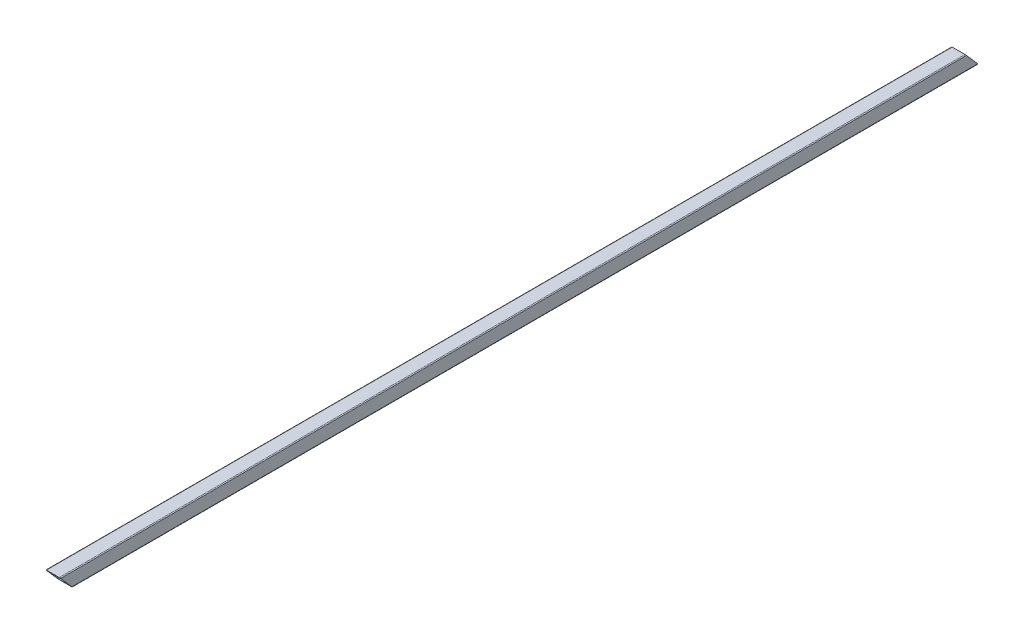
ISO-10303-21;
HEADER;
FILE_DESCRIPTION(('STEP AP214'),'2;1');
FILE_NAME('part.step','',(''),(''),'','','');
FILE_SCHEMA(('AUTOMOTIVE_DESIGN { 1 0 10303 214 1 1 1 1 }'));
ENDSEC;
DATA;
#1=APPLICATION_CONTEXT('core data for automotive mechanical design processes');
#2=APPLICATION_PROTOCOL_DEFINITION('international standard','automotive_design',2000,#1);
#3=PRODUCT_CONTEXT('',#1,'mechanical');
#4=PRODUCT('Part','Part','',(#3));
#5=PRODUCT_RELATED_PRODUCT_CATEGORY('part','',(#4));
#6=PRODUCT_DEFINITION_FORMATION('','',#4);
#7=PRODUCT_DEFINITION_CONTEXT('part definition',#1,'design');
#8=PRODUCT_DEFINITION('design','',#6,#7);
#9=PRODUCT_DEFINITION_SHAPE('','',#8);
#10=(LENGTH_UNIT() NAMED_UNIT(*) SI_UNIT(.MILLI.,.METRE.));
#11=(NAMED_UNIT(*) PLANE_ANGLE_UNIT() SI_UNIT($,.RADIAN.));
#12=(NAMED_UNIT(*) SI_UNIT($,.STERADIAN.) SOLID_ANGLE_UNIT());
#13=UNCERTAINTY_MEASURE_WITH_UNIT(LENGTH_MEASURE(1.E-05),#10,'distance_accuracy_value','');
#14=(GEOMETRIC_REPRESENTATION_CONTEXT(3) GLOBAL_UNCERTAINTY_ASSIGNED_CONTEXT((#13)) GLOBAL_UNIT_ASSIGNED_CONTEXT((#10,
#11,#12)) REPRESENTATION_CONTEXT('',''));
#15=CARTESIAN_POINT('',(0.,0.,0.));
#16=DIRECTION('',(0.,0.,1.));
#17=DIRECTION('',(1.,0.,0.));
#18=AXIS2_PLACEMENT_3D('',#15,#16,#17);
#19=CARTESIAN_POINT('',(-50.,22.,1648.34951321524));
#20=DIRECTION('',(1.,0.,0.));
#21=DIRECTION('',(0.,0.,-1.));
#22=AXIS2_PLACEMENT_3D('',#19,#20,#21);
#23=PLANE('',#22);
#24=DIRECTION('',(0.,-0.753477823126875,-0.657473322695291));
#25=VECTOR('',#24,1.);
#26=CARTESIAN_POINT('',(-50.,53.2499633570719,1612.53641852334));
#27=LINE('',#26,#25);
#28=CARTESIAN_POINT('',(-50.,22.,1585.26817437355));
#29=VERTEX_POINT('',#28);
#30=CARTESIAN_POINT('',(-50.,-22.,1546.87444159115));
#31=VERTEX_POINT('',#30);
#32=EDGE_CURVE('E232',#29,#31,#27,.T.);
#33=ORIENTED_EDGE('',*,*,#32,.F.);
#34=DIRECTION('',(0.,0.,-1.));
#35=VECTOR('',#34,1.);
#36=CARTESIAN_POINT('',(-50.,22.,1648.34951321524));
#37=LINE('',#36,#35);
#38=CARTESIAN_POINT('',(-50.,22.,-1546.87444159116));
#39=VERTEX_POINT('',#38);
#40=EDGE_CURVE('E49',#29,#39,#37,.T.);
#41=ORIENTED_EDGE('',*,*,#40,.T.);
#42=DIRECTION('',(0.,-0.753477823126875,-0.657473322695291));
#43=VECTOR('',#42,1.);
#44=CARTESIAN_POINT('',(-50.,-28.2698948395353,-1590.73918953361));
#45=LINE('',#44,#43);
#46=CARTESIAN_POINT('',(-50.,-22.,-1585.26817437355));
#47=VERTEX_POINT('',#46);
#48=EDGE_CURVE('E200',#39,#47,#45,.T.);
#49=ORIENTED_EDGE('',*,*,#48,.T.);
#50=DIRECTION('',(0.,0.,-1.));
#51=VECTOR('',#50,1.);
#52=CARTESIAN_POINT('',(-50.,-22.,1648.34951321524));
#53=LINE('',#52,#51);
#54=EDGE_CURVE('E269',#31,#47,#53,.T.);
#55=ORIENTED_EDGE('',*,*,#54,.F.);
#56=EDGE_LOOP('',(#33,#41,#49,#55));
#57=FACE_BOUND('',#56,.T.);
#58=ADVANCED_FACE('F34',(#57),#23,.F.);
#59=CARTESIAN_POINT('',(-47.,22.,1648.34951321524));
#60=DIRECTION('',(0.,0.,-1.));
#61=DIRECTION('',(-1.,0.,0.));
#62=AXIS2_PLACEMENT_3D('',#59,#60,#61);
#63=CYLINDRICAL_SURFACE('',#62,3.00000000000001);
#64=CARTESIAN_POINT('',(-47.,22.,1585.26817437355));
#65=DIRECTION('',(0.,-0.657473322695291,0.753477823126875));
#66=DIRECTION('',(0.,-0.753477823126875,-0.657473322695291));
#67=AXIS2_PLACEMENT_3D('',#64,#65,#66);
#68=ELLIPSE('',#67,3.98153722368396,3.00000000000001);
#69=CARTESIAN_POINT('',(-47.,25.,1587.88592888144));
#70=VERTEX_POINT('',#69);
#71=EDGE_CURVE('E235',#70,#29,#68,.T.);
#72=ORIENTED_EDGE('',*,*,#71,.F.);
#73=DIRECTION('',(0.,0.,-1.));
#74=VECTOR('',#73,1.);
#75=CARTESIAN_POINT('',(-47.,25.,1648.34951321524));
#76=LINE('',#75,#74);
#77=CARTESIAN_POINT('',(-47.,25.,-1544.25668708327));
#78=VERTEX_POINT('',#77);
#79=EDGE_CURVE('E272',#70,#78,#76,.T.);
#80=ORIENTED_EDGE('',*,*,#79,.T.);
#81=CARTESIAN_POINT('',(-47.,22.,-1546.87444159116));
#82=DIRECTION('',(0.,0.657473322695291,-0.753477823126875));
#83=DIRECTION('',(0.,0.753477823126875,0.657473322695291));
#84=AXIS2_PLACEMENT_3D('',#81,#82,#83);
#85=ELLIPSE('',#84,3.98153722368395,3.00000000000001);
#86=EDGE_CURVE('E203',#78,#39,#85,.F.);
#87=ORIENTED_EDGE('',*,*,#86,.T.);
#88=ORIENTED_EDGE('',*,*,#40,.F.);
#89=EDGE_LOOP('',(#72,#80,#87,#88));
#90=FACE_BOUND('',#89,.T.);
#91=ADVANCED_FACE('F289',(#90),#63,.T.);
#92=CARTESIAN_POINT('',(-47.,25.,1648.34951321524));
#93=DIRECTION('',(0.,-1.,0.));
#94=DIRECTION('',(1.,0.,0.));
#95=AXIS2_PLACEMENT_3D('',#92,#93,#94);
#96=PLANE('',#95);
#97=DIRECTION('',(-1.,0.,0.));
#98=VECTOR('',#97,1.);
#99=CARTESIAN_POINT('',(-47.,25.,1587.88592888144));
#100=LINE('',#99,#98);
#101=CARTESIAN_POINT('',(-3.00000000000001,25.,1587.88592888144));
#102=VERTEX_POINT('',#101);
#103=EDGE_CURVE('E238',#102,#70,#100,.T.);
#104=ORIENTED_EDGE('',*,*,#103,.F.);
#105=DIRECTION('',(0.,0.,-1.));
#106=VECTOR('',#105,1.);
#107=CARTESIAN_POINT('',(-3.00000000000001,25.,1648.34951321524));
#108=LINE('',#107,#106);
#109=CARTESIAN_POINT('',(-3.00000000000001,25.,-1544.25668708327));
#110=VERTEX_POINT('',#109);
#111=EDGE_CURVE('E274',#102,#110,#108,.T.);
#112=ORIENTED_EDGE('',*,*,#111,.T.);
#113=DIRECTION('',(-1.,0.,0.));
#114=VECTOR('',#113,1.);
#115=CARTESIAN_POINT('',(-47.,25.,-1544.25668708327));
#116=LINE('',#115,#114);
#117=EDGE_CURVE('E205',#110,#78,#116,.T.);
#118=ORIENTED_EDGE('',*,*,#117,.T.);
#119=ORIENTED_EDGE('',*,*,#79,.F.);
#120=EDGE_LOOP('',(#104,#112,#118,#119));
#121=FACE_BOUND('',#120,.T.);
#122=ADVANCED_FACE('F291',(#121),#96,.F.);
#123=CARTESIAN_POINT('',(-3.00000000000001,22.,1648.34951321524));
#124=DIRECTION('',(0.,0.,-1.));
#125=DIRECTION('',(-1.,0.,0.));
#126=AXIS2_PLACEMENT_3D('',#123,#124,#125);
#127=CYLINDRICAL_SURFACE('',#126,3.00000000000001);
#128=CARTESIAN_POINT('',(-3.00000000000001,22.,1585.26817437355));
#129=DIRECTION('',(0.,-0.657473322695291,0.753477823126875));
#130=DIRECTION('',(0.,-0.753477823126875,-0.657473322695291));
#131=AXIS2_PLACEMENT_3D('',#128,#129,#130);
#132=ELLIPSE('',#131,3.98153722368396,3.00000000000001);
#133=CARTESIAN_POINT('',(0.,22.,1585.26817437355));
#134=VERTEX_POINT('',#133);
#135=EDGE_CURVE('E241',#134,#102,#132,.T.);
#136=ORIENTED_EDGE('',*,*,#135,.F.);
#137=DIRECTION('',(0.,0.,-1.));
#138=VECTOR('',#137,1.);
#139=CARTESIAN_POINT('',(0.,22.,1648.34951321524));
#140=LINE('',#139,#138);
#141=CARTESIAN_POINT('',(0.,22.,-1546.87444159116));
#142=VERTEX_POINT('',#141);
#143=EDGE_CURVE('E276',#134,#142,#140,.T.);
#144=ORIENTED_EDGE('',*,*,#143,.T.);
#145=CARTESIAN_POINT('',(-3.00000000000001,22.,-1546.87444159116));
#146=DIRECTION('',(0.,0.657473322695291,-0.753477823126875));
#147=DIRECTION('',(0.,0.753477823126875,0.657473322695291));
#148=AXIS2_PLACEMENT_3D('',#145,#146,#147);
#149=ELLIPSE('',#148,3.98153722368396,3.00000000000001);
#150=EDGE_CURVE('E208',#142,#110,#149,.F.);
#151=ORIENTED_EDGE('',*,*,#150,.T.);
#152=ORIENTED_EDGE('',*,*,#111,.F.);
#153=EDGE_LOOP('',(#136,#144,#151,#152));
#154=FACE_BOUND('',#153,.T.);
#155=ADVANCED_FACE('F295',(#154),#127,.T.);
#156=CARTESIAN_POINT('',(0.,22.,1648.34951321524));
#157=DIRECTION('',(-1.,0.,0.));
#158=DIRECTION('',(0.,0.,1.));
#159=AXIS2_PLACEMENT_3D('',#156,#157,#158);
#160=PLANE('',#159);
#161=DIRECTION('',(0.,0.753477823126875,0.657473322695291));
#162=VECTOR('',#161,1.);
#163=CARTESIAN_POINT('',(0.,53.2499633570719,1612.53641852334));
#164=LINE('',#163,#162);
#165=CARTESIAN_POINT('',(0.,-22.,1546.87444159115));
#166=VERTEX_POINT('',#165);
#167=EDGE_CURVE('E244',#166,#134,#164,.T.);
#168=ORIENTED_EDGE('',*,*,#167,.F.);
#169=DIRECTION('',(0.,0.,-1.));
#170=VECTOR('',#169,1.);
#171=CARTESIAN_POINT('',(0.,-22.,1648.34951321524));
#172=LINE('',#171,#170);
#173=CARTESIAN_POINT('',(0.,-22.,-1585.26817437355));
#174=VERTEX_POINT('',#173);
#175=EDGE_CURVE('E157',#166,#174,#172,.T.);
#176=ORIENTED_EDGE('',*,*,#175,.T.);
#177=DIRECTION('',(0.,0.753477823126875,0.657473322695291));
#178=VECTOR('',#177,1.);
#179=CARTESIAN_POINT('',(0.,-28.2698948395353,-1590.73918953361));
#180=LINE('',#179,#178);
#181=EDGE_CURVE('E169',#174,#142,#180,.T.);
#182=ORIENTED_EDGE('',*,*,#181,.T.);
#183=ORIENTED_EDGE('',*,*,#143,.F.);
#184=EDGE_LOOP('',(#168,#176,#182,#183));
#185=FACE_BOUND('',#184,.T.);
#186=ADVANCED_FACE('F279',(#185),#160,.F.);
#187=CARTESIAN_POINT('',(-3.00000000000001,-22.,1648.34951321524));
#188=DIRECTION('',(0.,0.,-1.));
#189=DIRECTION('',(-1.,0.,0.));
#190=AXIS2_PLACEMENT_3D('',#187,#188,#189);
#191=CYLINDRICAL_SURFACE('',#190,3.);
#192=CARTESIAN_POINT('',(-3.00000000000001,-22.,1546.87444159115));
#193=DIRECTION('',(0.,-0.657473322695291,0.753477823126875));
#194=DIRECTION('',(0.,-0.753477823126875,-0.657473322695291));
#195=AXIS2_PLACEMENT_3D('',#192,#193,#194);
#196=ELLIPSE('',#195,3.98153722368395,3.);
#197=CARTESIAN_POINT('',(-3.,-25.,1544.25668708326));
#198=VERTEX_POINT('',#197);
#199=EDGE_CURVE('E153',#198,#166,#196,.T.);
#200=ORIENTED_EDGE('',*,*,#199,.F.);
#201=DIRECTION('',(0.,0.,-1.));
#202=VECTOR('',#201,1.);
#203=CARTESIAN_POINT('',(-3.,-25.,1648.34951321524));
#204=LINE('',#203,#202);
#205=CARTESIAN_POINT('',(-3.,-25.,-1587.88592888144));
#206=VERTEX_POINT('',#205);
#207=EDGE_CURVE('E147',#198,#206,#204,.T.);
#208=ORIENTED_EDGE('',*,*,#207,.T.);
#209=CARTESIAN_POINT('',(-3.00000000000001,-22.,-1585.26817437355));
#210=DIRECTION('',(0.,0.657473322695291,-0.753477823126875));
#211=DIRECTION('',(0.,0.753477823126875,0.657473322695291));
#212=AXIS2_PLACEMENT_3D('',#209,#210,#211);
#213=ELLIPSE('',#212,3.98153722368395,3.);
#214=EDGE_CURVE('E151',#206,#174,#213,.F.);
#215=ORIENTED_EDGE('',*,*,#214,.T.);
#216=ORIENTED_EDGE('',*,*,#175,.F.);
#217=EDGE_LOOP('',(#200,#208,#215,#216));
#218=FACE_BOUND('',#217,.T.);
#219=ADVANCED_FACE('F149',(#218),#191,.T.);
#220=CARTESIAN_POINT('',(-47.,-25.,1648.34951321524));
#221=DIRECTION('',(0.,1.,0.));
#222=DIRECTION('',(0.,0.,1.));
#223=AXIS2_PLACEMENT_3D('',#220,#221,#222);
#224=PLANE('',#223);
#225=DIRECTION('',(1.,0.,0.));
#226=VECTOR('',#225,1.);
#227=CARTESIAN_POINT('',(-47.,-25.,1544.25668708326));
#228=LINE('',#227,#226);
#229=CARTESIAN_POINT('',(-47.,-25.,1544.25668708326));
#230=VERTEX_POINT('',#229);
#231=EDGE_CURVE('E248',#230,#198,#228,.T.);
#232=ORIENTED_EDGE('',*,*,#231,.F.);
#233=DIRECTION('',(0.,0.,-1.));
#234=VECTOR('',#233,1.);
#235=CARTESIAN_POINT('',(-47.,-25.,1648.34951321524));
#236=LINE('',#235,#234);
#237=CARTESIAN_POINT('',(-47.,-25.,-1587.88592888144));
#238=VERTEX_POINT('',#237);
#239=EDGE_CURVE('E42',#230,#238,#236,.T.);
#240=ORIENTED_EDGE('',*,*,#239,.T.);
#241=DIRECTION('',(1.,0.,0.));
#242=VECTOR('',#241,1.);
#243=CARTESIAN_POINT('',(-47.,-25.,-1587.88592888144));
#244=LINE('',#243,#242);
#245=EDGE_CURVE('E165',#238,#206,#244,.T.);
#246=ORIENTED_EDGE('',*,*,#245,.T.);
#247=ORIENTED_EDGE('',*,*,#207,.F.);
#248=EDGE_LOOP('',(#232,#240,#246,#247));
#249=FACE_BOUND('',#248,.T.);
#250=ADVANCED_FACE('F171',(#249),#224,.F.);
#251=CARTESIAN_POINT('',(-47.,-22.,1648.34951321524));
#252=DIRECTION('',(0.,0.,-1.));
#253=DIRECTION('',(-1.,0.,0.));
#254=AXIS2_PLACEMENT_3D('',#251,#252,#253);
#255=CYLINDRICAL_SURFACE('',#254,3.);
#256=CARTESIAN_POINT('',(-47.,-22.,1546.87444159115));
#257=DIRECTION('',(0.,-0.657473322695291,0.753477823126875));
#258=DIRECTION('',(0.,-0.753477823126875,-0.657473322695291));
#259=AXIS2_PLACEMENT_3D('',#256,#257,#258);
#260=ELLIPSE('',#259,3.98153722368395,3.);
#261=EDGE_CURVE('E250',#31,#230,#260,.T.);
#262=ORIENTED_EDGE('',*,*,#261,.F.);
#263=ORIENTED_EDGE('',*,*,#54,.T.);
#264=CARTESIAN_POINT('',(-47.,-22.,-1585.26817437355));
#265=DIRECTION('',(0.,0.657473322695291,-0.753477823126875));
#266=DIRECTION('',(0.,0.753477823126875,0.657473322695291));
#267=AXIS2_PLACEMENT_3D('',#264,#265,#266);
#268=ELLIPSE('',#267,3.98153722368395,3.);
#269=EDGE_CURVE('E198',#47,#238,#268,.F.);
#270=ORIENTED_EDGE('',*,*,#269,.T.);
#271=ORIENTED_EDGE('',*,*,#239,.F.);
#272=EDGE_LOOP('',(#262,#263,#270,#271));
#273=FACE_BOUND('',#272,.T.);
#274=ADVANCED_FACE('F36',(#273),#255,.T.);
#275=CARTESIAN_POINT('',(-47.,20.,1648.34951321524));
#276=DIRECTION('',(1.,0.,0.));
#277=DIRECTION('',(0.,0.,-1.));
#278=AXIS2_PLACEMENT_3D('',#275,#276,#277);
#279=PLANE('',#278);
#280=DIRECTION('',(0.,0.,-1.));
#281=VECTOR('',#280,1.);
#282=CARTESIAN_POINT('',(-47.,20.,1648.34951321524));
#283=LINE('',#282,#281);
#284=CARTESIAN_POINT('',(-47.,20.,1583.52300470162));
#285=VERTEX_POINT('',#284);
#286=CARTESIAN_POINT('',(-47.,20.,-1548.61961126308));
#287=VERTEX_POINT('',#286);
#288=EDGE_CURVE('E255',#285,#287,#283,.T.);
#289=ORIENTED_EDGE('',*,*,#288,.F.);
#290=DIRECTION('',(0.,-0.753477823126875,-0.657473322695291));
#291=VECTOR('',#290,1.);
#292=CARTESIAN_POINT('',(-47.,52.1145056971838,1611.54563538745));
#293=LINE('',#292,#291);
#294=CARTESIAN_POINT('',(-47.,-20.,1548.61961126308));
#295=VERTEX_POINT('',#294);
#296=EDGE_CURVE('E11',#285,#295,#293,.T.);
#297=ORIENTED_EDGE('',*,*,#296,.T.);
#298=DIRECTION('',(0.,0.,-1.));
#299=VECTOR('',#298,1.);
#300=CARTESIAN_POINT('',(-47.,-20.,1648.34951321524));
#301=LINE('',#300,#299);
#302=CARTESIAN_POINT('',(-47.,-20.,-1583.52300470162));
#303=VERTEX_POINT('',#302);
#304=EDGE_CURVE('E253',#295,#303,#301,.T.);
#305=ORIENTED_EDGE('',*,*,#304,.T.);
#306=DIRECTION('',(0.,-0.753477823126875,-0.657473322695291));
#307=VECTOR('',#306,1.);
#308=CARTESIAN_POINT('',(-47.,-29.4053524994233,-1591.72997266951));
#309=LINE('',#308,#307);
#310=EDGE_CURVE('E173',#287,#303,#309,.T.);
#311=ORIENTED_EDGE('',*,*,#310,.F.);
#312=EDGE_LOOP('',(#289,#297,#305,#311));
#313=FACE_BOUND('',#312,.T.);
#314=ADVANCED_FACE('F338',(#313),#279,.T.);
#315=CARTESIAN_POINT('',(-45.,20.,1648.34951321524));
#316=DIRECTION('',(0.,0.,-1.));
#317=DIRECTION('',(-1.,0.,0.));
#318=AXIS2_PLACEMENT_3D('',#315,#316,#317);
#319=CYLINDRICAL_SURFACE('',#318,2.);
#320=DIRECTION('',(0.,0.,-1.));
#321=VECTOR('',#320,1.);
#322=CARTESIAN_POINT('',(-45.,22.,1648.34951321524));
#323=LINE('',#322,#321);
#324=CARTESIAN_POINT('',(-45.,22.,1585.26817437355));
#325=VERTEX_POINT('',#324);
#326=CARTESIAN_POINT('',(-45.,22.,-1546.87444159116));
#327=VERTEX_POINT('',#326);
#328=EDGE_CURVE('E257',#325,#327,#323,.T.);
#329=ORIENTED_EDGE('',*,*,#328,.F.);
#330=CARTESIAN_POINT('',(-45.,20.,1583.52300470162));
#331=DIRECTION('',(0.,-0.657473322695291,0.753477823126875));
#332=DIRECTION('',(0.,-0.753477823126875,-0.657473322695291));
#333=AXIS2_PLACEMENT_3D('',#330,#331,#332);
#334=ELLIPSE('',#333,2.65435814912263,2.);
#335=EDGE_CURVE('E185',#325,#285,#334,.T.);
#336=ORIENTED_EDGE('',*,*,#335,.T.);
#337=ORIENTED_EDGE('',*,*,#288,.T.);
#338=CARTESIAN_POINT('',(-45.,20.,-1548.61961126308));
#339=DIRECTION('',(0.,0.657473322695291,-0.753477823126875));
#340=DIRECTION('',(0.,0.753477823126875,0.657473322695291));
#341=AXIS2_PLACEMENT_3D('',#338,#339,#340);
#342=ELLIPSE('',#341,2.65435814912263,2.);
#343=EDGE_CURVE('E182',#327,#287,#342,.F.);
#344=ORIENTED_EDGE('',*,*,#343,.F.);
#345=EDGE_LOOP('',(#329,#336,#337,#344));
#346=FACE_BOUND('',#345,.T.);
#347=ADVANCED_FACE('F334',(#346),#319,.F.);
#348=CARTESIAN_POINT('',(-45.,22.,1648.34951321524));
#349=DIRECTION('',(0.,-1.,0.));
#350=DIRECTION('',(0.,0.,-1.));
#351=AXIS2_PLACEMENT_3D('',#348,#349,#350);
#352=PLANE('',#351);
#353=DIRECTION('',(0.,0.,-1.));
#354=VECTOR('',#353,1.);
#355=CARTESIAN_POINT('',(-5.00000000000001,22.,1648.34951321524));
#356=LINE('',#355,#354);
#357=CARTESIAN_POINT('',(-5.00000000000001,22.,1585.26817437355));
#358=VERTEX_POINT('',#357);
#359=CARTESIAN_POINT('',(-5.00000000000001,22.,-1546.87444159116));
#360=VERTEX_POINT('',#359);
#361=EDGE_CURVE('E259',#358,#360,#356,.T.);
#362=ORIENTED_EDGE('',*,*,#361,.F.);
#363=DIRECTION('',(-1.,0.,0.));
#364=VECTOR('',#363,1.);
#365=CARTESIAN_POINT('',(-45.,22.,1585.26817437355));
#366=LINE('',#365,#364);
#367=EDGE_CURVE('E216',#358,#325,#366,.T.);
#368=ORIENTED_EDGE('',*,*,#367,.T.);
#369=ORIENTED_EDGE('',*,*,#328,.T.);
#370=DIRECTION('',(-1.,0.,0.));
#371=VECTOR('',#370,1.);
#372=CARTESIAN_POINT('',(-45.,22.,-1546.87444159116));
#373=LINE('',#372,#371);
#374=EDGE_CURVE('E186',#360,#327,#373,.T.);
#375=ORIENTED_EDGE('',*,*,#374,.F.);
#376=EDGE_LOOP('',(#362,#368,#369,#375));
#377=FACE_BOUND('',#376,.T.);
#378=ADVANCED_FACE('F330',(#377),#352,.T.);
#379=CARTESIAN_POINT('',(-5.00000000000001,20.,1648.34951321524));
#380=DIRECTION('',(0.,0.,-1.));
#381=DIRECTION('',(-1.,0.,0.));
#382=AXIS2_PLACEMENT_3D('',#379,#380,#381);
#383=CYLINDRICAL_SURFACE('',#382,2.);
#384=DIRECTION('',(0.,0.,-1.));
#385=VECTOR('',#384,1.);
#386=CARTESIAN_POINT('',(-3.00000000000001,20.,1648.34951321524));
#387=LINE('',#386,#385);
#388=CARTESIAN_POINT('',(-3.00000000000001,20.,1583.52300470162));
#389=VERTEX_POINT('',#388);
#390=CARTESIAN_POINT('',(-3.00000000000001,20.,-1548.61961126308));
#391=VERTEX_POINT('',#390);
#392=EDGE_CURVE('E261',#389,#391,#387,.T.);
#393=ORIENTED_EDGE('',*,*,#392,.F.);
#394=CARTESIAN_POINT('',(-5.00000000000001,20.,1583.52300470162));
#395=DIRECTION('',(0.,-0.657473322695291,0.753477823126875));
#396=DIRECTION('',(0.,-0.753477823126875,-0.657473322695291));
#397=AXIS2_PLACEMENT_3D('',#394,#395,#396);
#398=ELLIPSE('',#397,2.65435814912263,2.);
#399=EDGE_CURVE('E219',#389,#358,#398,.T.);
#400=ORIENTED_EDGE('',*,*,#399,.T.);
#401=ORIENTED_EDGE('',*,*,#361,.T.);
#402=CARTESIAN_POINT('',(-5.00000000000001,20.,-1548.61961126308));
#403=DIRECTION('',(0.,0.657473322695291,-0.753477823126875));
#404=DIRECTION('',(0.,0.753477823126875,0.657473322695291));
#405=AXIS2_PLACEMENT_3D('',#402,#403,#404);
#406=ELLIPSE('',#405,2.65435814912263,2.);
#407=EDGE_CURVE('E189',#391,#360,#406,.F.);
#408=ORIENTED_EDGE('',*,*,#407,.F.);
#409=EDGE_LOOP('',(#393,#400,#401,#408));
#410=FACE_BOUND('',#409,.T.);
#411=ADVANCED_FACE('F326',(#410),#383,.F.);
#412=CARTESIAN_POINT('',(-3.00000000000001,20.,1648.34951321524));
#413=DIRECTION('',(-1.,0.,0.));
#414=DIRECTION('',(0.,0.,1.));
#415=AXIS2_PLACEMENT_3D('',#412,#413,#414);
#416=PLANE('',#415);
#417=DIRECTION('',(0.,0.,-1.));
#418=VECTOR('',#417,1.);
#419=CARTESIAN_POINT('',(-3.00000000000001,-20.,1648.34951321524));
#420=LINE('',#419,#418);
#421=CARTESIAN_POINT('',(-3.00000000000001,-20.,1548.61961126308));
#422=VERTEX_POINT('',#421);
#423=CARTESIAN_POINT('',(-3.00000000000001,-20.,-1583.52300470162));
#424=VERTEX_POINT('',#423);
#425=EDGE_CURVE('E263',#422,#424,#420,.T.);
#426=ORIENTED_EDGE('',*,*,#425,.F.);
#427=DIRECTION('',(0.,0.753477823126875,0.657473322695291));
#428=VECTOR('',#427,1.);
#429=CARTESIAN_POINT('',(-3.00000000000001,52.1145056971838,1611.54563538745));
#430=LINE('',#429,#428);
#431=EDGE_CURVE('E222',#422,#389,#430,.T.);
#432=ORIENTED_EDGE('',*,*,#431,.T.);
#433=ORIENTED_EDGE('',*,*,#392,.T.);
#434=DIRECTION('',(0.,0.753477823126875,0.657473322695291));
#435=VECTOR('',#434,1.);
#436=CARTESIAN_POINT('',(-3.00000000000001,-29.4053524994233,-1591.72997266951));
#437=LINE('',#436,#435);
#438=EDGE_CURVE('E192',#424,#391,#437,.T.);
#439=ORIENTED_EDGE('',*,*,#438,.F.);
#440=EDGE_LOOP('',(#426,#432,#433,#439));
#441=FACE_BOUND('',#440,.T.);
#442=ADVANCED_FACE('F322',(#441),#416,.T.);
#443=CARTESIAN_POINT('',(-5.00000000000001,-20.,1648.34951321524));
#444=DIRECTION('',(0.,0.,-1.));
#445=DIRECTION('',(-1.,0.,0.));
#446=AXIS2_PLACEMENT_3D('',#443,#444,#445);
#447=CYLINDRICAL_SURFACE('',#446,2.);
#448=DIRECTION('',(0.,0.,-1.));
#449=VECTOR('',#448,1.);
#450=CARTESIAN_POINT('',(-5.00000000000001,-22.,1648.34951321524));
#451=LINE('',#450,#449);
#452=CARTESIAN_POINT('',(-5.00000000000001,-22.,1546.87444159115));
#453=VERTEX_POINT('',#452);
#454=CARTESIAN_POINT('',(-5.00000000000001,-22.,-1585.26817437355));
#455=VERTEX_POINT('',#454);
#456=EDGE_CURVE('E265',#453,#455,#451,.T.);
#457=ORIENTED_EDGE('',*,*,#456,.F.);
#458=CARTESIAN_POINT('',(-5.00000000000001,-20.,1548.61961126308));
#459=DIRECTION('',(0.,-0.657473322695291,0.753477823126875));
#460=DIRECTION('',(0.,-0.753477823126875,-0.657473322695291));
#461=AXIS2_PLACEMENT_3D('',#458,#459,#460);
#462=ELLIPSE('',#461,2.65435814912263,2.);
#463=EDGE_CURVE('E225',#453,#422,#462,.T.);
#464=ORIENTED_EDGE('',*,*,#463,.T.);
#465=ORIENTED_EDGE('',*,*,#425,.T.);
#466=CARTESIAN_POINT('',(-5.00000000000001,-20.,-1583.52300470162));
#467=DIRECTION('',(0.,0.657473322695291,-0.753477823126875));
#468=DIRECTION('',(0.,0.753477823126875,0.657473322695291));
#469=AXIS2_PLACEMENT_3D('',#466,#467,#468);
#470=ELLIPSE('',#469,2.65435814912263,2.);
#471=EDGE_CURVE('E195',#455,#424,#470,.F.);
#472=ORIENTED_EDGE('',*,*,#471,.F.);
#473=EDGE_LOOP('',(#457,#464,#465,#472));
#474=FACE_BOUND('',#473,.T.);
#475=ADVANCED_FACE('F318',(#474),#447,.F.);
#476=CARTESIAN_POINT('',(-45.,-22.,1648.34951321524));
#477=DIRECTION('',(0.,1.,0.));
#478=DIRECTION('',(0.,0.,1.));
#479=AXIS2_PLACEMENT_3D('',#476,#477,#478);
#480=PLANE('',#479);
#481=DIRECTION('',(0.,0.,-1.));
#482=VECTOR('',#481,1.);
#483=CARTESIAN_POINT('',(-45.,-22.,1648.34951321524));
#484=LINE('',#483,#482);
#485=CARTESIAN_POINT('',(-45.,-22.,1546.87444159115));
#486=VERTEX_POINT('',#485);
#487=CARTESIAN_POINT('',(-45.,-22.,-1585.26817437355));
#488=VERTEX_POINT('',#487);
#489=EDGE_CURVE('E267',#486,#488,#484,.T.);
#490=ORIENTED_EDGE('',*,*,#489,.F.);
#491=DIRECTION('',(1.,0.,0.));
#492=VECTOR('',#491,1.);
#493=CARTESIAN_POINT('',(-45.,-22.,1546.87444159115));
#494=LINE('',#493,#492);
#495=EDGE_CURVE('E228',#486,#453,#494,.T.);
#496=ORIENTED_EDGE('',*,*,#495,.T.);
#497=ORIENTED_EDGE('',*,*,#456,.T.);
#498=DIRECTION('',(1.,0.,0.));
#499=VECTOR('',#498,1.);
#500=CARTESIAN_POINT('',(-45.,-22.,-1585.26817437355));
#501=LINE('',#500,#499);
#502=EDGE_CURVE('E180',#488,#455,#501,.T.);
#503=ORIENTED_EDGE('',*,*,#502,.F.);
#504=EDGE_LOOP('',(#490,#496,#497,#503));
#505=FACE_BOUND('',#504,.T.);
#506=ADVANCED_FACE('F314',(#505),#480,.T.);
#507=CARTESIAN_POINT('',(-45.,-20.,1648.34951321524));
#508=DIRECTION('',(0.,0.,-1.));
#509=DIRECTION('',(-1.,0.,0.));
#510=AXIS2_PLACEMENT_3D('',#507,#508,#509);
#511=CYLINDRICAL_SURFACE('',#510,2.);
#512=ORIENTED_EDGE('',*,*,#304,.F.);
#513=CARTESIAN_POINT('',(-45.,-20.,1548.61961126308));
#514=DIRECTION('',(0.,-0.657473322695291,0.753477823126875));
#515=DIRECTION('',(0.,-0.753477823126875,-0.657473322695291));
#516=AXIS2_PLACEMENT_3D('',#513,#514,#515);
#517=ELLIPSE('',#516,2.65435814912263,2.);
#518=EDGE_CURVE('E57',#295,#486,#517,.T.);
#519=ORIENTED_EDGE('',*,*,#518,.T.);
#520=ORIENTED_EDGE('',*,*,#489,.T.);
#521=CARTESIAN_POINT('',(-45.,-20.,-1583.52300470162));
#522=DIRECTION('',(0.,0.657473322695291,-0.753477823126875));
#523=DIRECTION('',(0.,0.753477823126875,0.657473322695291));
#524=AXIS2_PLACEMENT_3D('',#521,#522,#523);
#525=ELLIPSE('',#524,2.65435814912263,2.);
#526=EDGE_CURVE('E176',#303,#488,#525,.F.);
#527=ORIENTED_EDGE('',*,*,#526,.F.);
#528=EDGE_LOOP('',(#512,#519,#520,#527));
#529=FACE_BOUND('',#528,.T.);
#530=ADVANCED_FACE('F311',(#529),#511,.F.);
#531=CARTESIAN_POINT('',(-93.9999999999994,162.743492870142,1708.07881201257));
#532=DIRECTION('',(0.,-0.657473322695291,0.753477823126875));
#533=DIRECTION('',(0.,-0.753477823126875,-0.657473322695291));
#534=AXIS2_PLACEMENT_3D('',#531,#532,#533);
#535=PLANE('',#534);
#536=ORIENTED_EDGE('',*,*,#518,.F.);
#537=ORIENTED_EDGE('',*,*,#296,.F.);
#538=ORIENTED_EDGE('',*,*,#335,.F.);
#539=ORIENTED_EDGE('',*,*,#367,.F.);
#540=ORIENTED_EDGE('',*,*,#399,.F.);
#541=ORIENTED_EDGE('',*,*,#431,.F.);
#542=ORIENTED_EDGE('',*,*,#463,.F.);
#543=ORIENTED_EDGE('',*,*,#495,.F.);
#544=EDGE_LOOP('',(#536,#537,#538,#539,#540,#541,#542,#543));
#545=FACE_BOUND('',#544,.T.);
#546=ORIENTED_EDGE('',*,*,#32,.T.);
#547=ORIENTED_EDGE('',*,*,#261,.T.);
#548=ORIENTED_EDGE('',*,*,#231,.T.);
#549=ORIENTED_EDGE('',*,*,#199,.T.);
#550=ORIENTED_EDGE('',*,*,#167,.T.);
#551=ORIENTED_EDGE('',*,*,#135,.T.);
#552=ORIENTED_EDGE('',*,*,#103,.T.);
#553=ORIENTED_EDGE('',*,*,#71,.T.);
#554=EDGE_LOOP('',(#546,#547,#548,#549,#550,#551,#552,#553));
#555=FACE_BOUND('',#554,.T.);
#556=ADVANCED_FACE('F282',(#545,#555),#535,.T.);
#557=CARTESIAN_POINT('',(-93.9999999999994,1515.02594623238,-244.082641208738));
#558=DIRECTION('',(0.,0.657473322695291,-0.753477823126875));
#559=DIRECTION('',(0.,0.753477823126875,0.657473322695291));
#560=AXIS2_PLACEMENT_3D('',#557,#558,#559);
#561=PLANE('',#560);
#562=ORIENTED_EDGE('',*,*,#269,.F.);
#563=ORIENTED_EDGE('',*,*,#48,.F.);
#564=ORIENTED_EDGE('',*,*,#86,.F.);
#565=ORIENTED_EDGE('',*,*,#117,.F.);
#566=ORIENTED_EDGE('',*,*,#150,.F.);
#567=ORIENTED_EDGE('',*,*,#181,.F.);
#568=ORIENTED_EDGE('',*,*,#214,.F.);
#569=ORIENTED_EDGE('',*,*,#245,.F.);
#570=EDGE_LOOP('',(#562,#563,#564,#565,#566,#567,#568,#569));
#571=FACE_BOUND('',#570,.T.);
#572=ORIENTED_EDGE('',*,*,#310,.T.);
#573=ORIENTED_EDGE('',*,*,#526,.T.);
#574=ORIENTED_EDGE('',*,*,#502,.T.);
#575=ORIENTED_EDGE('',*,*,#471,.T.);
#576=ORIENTED_EDGE('',*,*,#438,.T.);
#577=ORIENTED_EDGE('',*,*,#407,.T.);
#578=ORIENTED_EDGE('',*,*,#374,.T.);
#579=ORIENTED_EDGE('',*,*,#343,.T.);
#580=EDGE_LOOP('',(#572,#573,#574,#575,#576,#577,#578,#579));
#581=FACE_BOUND('',#580,.T.);
#582=ADVANCED_FACE('F163',(#571,#581),#561,.T.);
#583=CLOSED_SHELL('',(#58,#91,#122,#155,#186,#219,#250,#274,#314,#347,#378,#411,#442,#475,#506,
#530,#556,#582));
#584=MANIFOLD_SOLID_BREP('B2',#583);
#585=ADVANCED_BREP_SHAPE_REPRESENTATION('',(#18,#584),#14);
#586=SHAPE_DEFINITION_REPRESENTATION(#9,#585);
ENDSEC;
END-ISO-10303-21;
